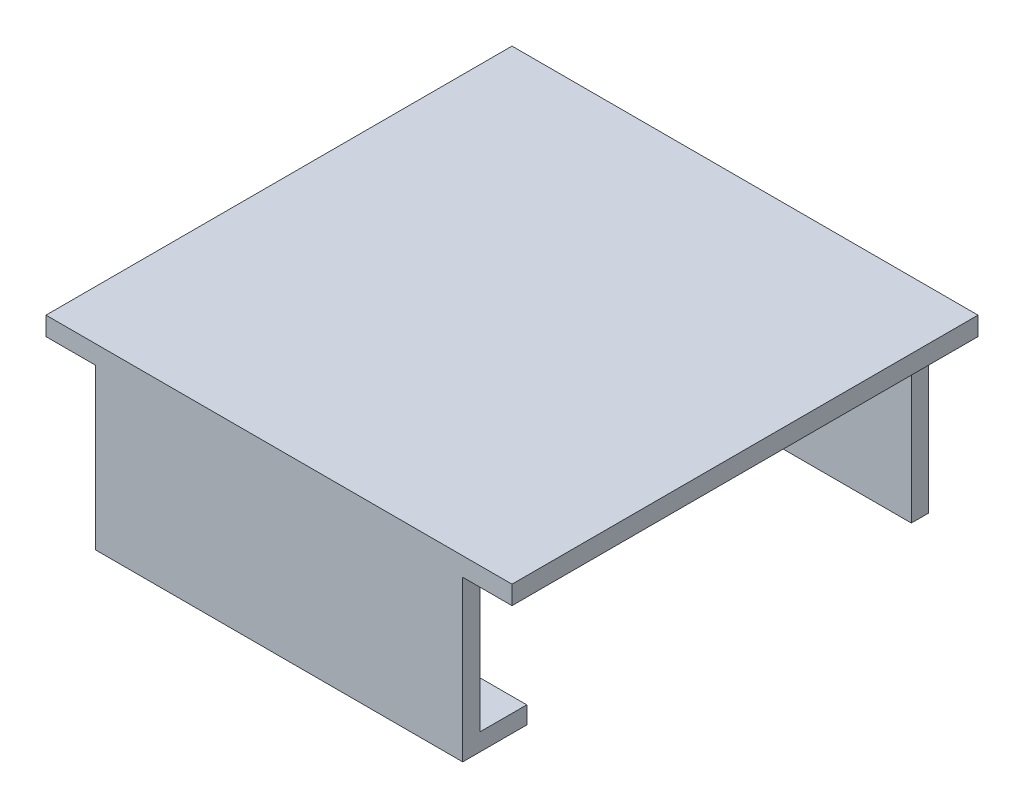
ISO-10303-21;
HEADER;
FILE_DESCRIPTION(('STEP AP214'),'2;1');
FILE_NAME('part.step','',(''),(''),'','','');
FILE_SCHEMA(('AUTOMOTIVE_DESIGN { 1 0 10303 214 1 1 1 1 }'));
ENDSEC;
DATA;
#1=APPLICATION_CONTEXT('core data for automotive mechanical design processes');
#2=APPLICATION_PROTOCOL_DEFINITION('international standard','automotive_design',2000,#1);
#3=PRODUCT_CONTEXT('',#1,'mechanical');
#4=PRODUCT('Part','Part','',(#3));
#5=PRODUCT_RELATED_PRODUCT_CATEGORY('part','',(#4));
#6=PRODUCT_DEFINITION_FORMATION('','',#4);
#7=PRODUCT_DEFINITION_CONTEXT('part definition',#1,'design');
#8=PRODUCT_DEFINITION('design','',#6,#7);
#9=PRODUCT_DEFINITION_SHAPE('','',#8);
#10=(LENGTH_UNIT() NAMED_UNIT(*) SI_UNIT(.MILLI.,.METRE.));
#11=(NAMED_UNIT(*) PLANE_ANGLE_UNIT() SI_UNIT($,.RADIAN.));
#12=(NAMED_UNIT(*) SI_UNIT($,.STERADIAN.) SOLID_ANGLE_UNIT());
#13=UNCERTAINTY_MEASURE_WITH_UNIT(LENGTH_MEASURE(1.E-05),#10,'distance_accuracy_value','');
#14=(GEOMETRIC_REPRESENTATION_CONTEXT(3) GLOBAL_UNCERTAINTY_ASSIGNED_CONTEXT((#13)) GLOBAL_UNIT_ASSIGNED_CONTEXT((#10,
#11,#12)) REPRESENTATION_CONTEXT('',''));
#15=CARTESIAN_POINT('',(0.,0.,0.));
#16=DIRECTION('',(0.,0.,1.));
#17=DIRECTION('',(1.,0.,0.));
#18=AXIS2_PLACEMENT_3D('',#15,#16,#17);
#19=CARTESIAN_POINT('',(0.,0.,0.));
#20=DIRECTION('',(0.,1.,0.));
#21=DIRECTION('',(0.,0.,1.));
#22=AXIS2_PLACEMENT_3D('',#19,#20,#21);
#23=PLANE('',#22);
#24=DIRECTION('',(0.,0.,-1.));
#25=VECTOR('',#24,1.);
#26=CARTESIAN_POINT('',(5.285,0.,-1.87));
#27=LINE('',#26,#25);
#28=CARTESIAN_POINT('',(5.285,0.,0.));
#29=VERTEX_POINT('',#28);
#30=CARTESIAN_POINT('',(5.285,0.,-1.87));
#31=VERTEX_POINT('',#30);
#32=EDGE_CURVE('E214',#29,#31,#27,.T.);
#33=ORIENTED_EDGE('',*,*,#32,.F.);
#34=DIRECTION('',(1.,0.,0.));
#35=VECTOR('',#34,1.);
#36=CARTESIAN_POINT('',(0.,0.,0.));
#37=LINE('',#36,#35);
#38=CARTESIAN_POINT('',(0.,0.,0.));
#39=VERTEX_POINT('',#38);
#40=EDGE_CURVE('E247',#39,#29,#37,.T.);
#41=ORIENTED_EDGE('',*,*,#40,.F.);
#42=DIRECTION('',(0.,0.,-1.));
#43=VECTOR('',#42,1.);
#44=CARTESIAN_POINT('',(0.,0.,0.));
#45=LINE('',#44,#43);
#46=CARTESIAN_POINT('',(0.,0.,-50.));
#47=VERTEX_POINT('',#46);
#48=EDGE_CURVE('E238',#39,#47,#45,.T.);
#49=ORIENTED_EDGE('',*,*,#48,.T.);
#50=DIRECTION('',(1.,0.,0.));
#51=VECTOR('',#50,1.);
#52=CARTESIAN_POINT('',(0.,0.,-50.));
#53=LINE('',#52,#51);
#54=CARTESIAN_POINT('',(5.285,0.,-50.));
#55=VERTEX_POINT('',#54);
#56=EDGE_CURVE('E254',#47,#55,#53,.T.);
#57=ORIENTED_EDGE('',*,*,#56,.T.);
#58=DIRECTION('',(0.,0.,-1.));
#59=VECTOR('',#58,1.);
#60=CARTESIAN_POINT('',(5.285,0.,-50.));
#61=LINE('',#60,#59);
#62=CARTESIAN_POINT('',(5.285,0.,-48.13));
#63=VERTEX_POINT('',#62);
#64=EDGE_CURVE('E62',#63,#55,#61,.T.);
#65=ORIENTED_EDGE('',*,*,#64,.F.);
#66=DIRECTION('',(-1.,0.,0.));
#67=VECTOR('',#66,1.);
#68=CARTESIAN_POINT('',(5.285,0.,-48.13));
#69=LINE('',#68,#67);
#70=CARTESIAN_POINT('',(44.715,0.,-48.13));
#71=VERTEX_POINT('',#70);
#72=EDGE_CURVE('E226',#71,#63,#69,.T.);
#73=ORIENTED_EDGE('',*,*,#72,.F.);
#74=DIRECTION('',(0.,0.,1.));
#75=VECTOR('',#74,1.);
#76=CARTESIAN_POINT('',(44.715,0.,-50.));
#77=LINE('',#76,#75);
#78=CARTESIAN_POINT('',(44.715,0.,-50.));
#79=VERTEX_POINT('',#78);
#80=EDGE_CURVE('E223',#79,#71,#77,.T.);
#81=ORIENTED_EDGE('',*,*,#80,.F.);
#82=CARTESIAN_POINT('',(50.,0.,-50.));
#83=VERTEX_POINT('',#82);
#84=EDGE_CURVE('E253',#79,#83,#53,.T.);
#85=ORIENTED_EDGE('',*,*,#84,.T.);
#86=DIRECTION('',(0.,0.,-1.));
#87=VECTOR('',#86,1.);
#88=CARTESIAN_POINT('',(50.,0.,0.));
#89=LINE('',#88,#87);
#90=CARTESIAN_POINT('',(50.,0.,0.));
#91=VERTEX_POINT('',#90);
#92=EDGE_CURVE('E250',#91,#83,#89,.T.);
#93=ORIENTED_EDGE('',*,*,#92,.F.);
#94=CARTESIAN_POINT('',(44.715,0.,0.));
#95=VERTEX_POINT('',#94);
#96=EDGE_CURVE('E149',#95,#91,#37,.T.);
#97=ORIENTED_EDGE('',*,*,#96,.F.);
#98=DIRECTION('',(0.,0.,1.));
#99=VECTOR('',#98,1.);
#100=CARTESIAN_POINT('',(44.715,0.,-1.87));
#101=LINE('',#100,#99);
#102=CARTESIAN_POINT('',(44.715,0.,-1.87));
#103=VERTEX_POINT('',#102);
#104=EDGE_CURVE('E208',#103,#95,#101,.T.);
#105=ORIENTED_EDGE('',*,*,#104,.F.);
#106=DIRECTION('',(1.,0.,0.));
#107=VECTOR('',#106,1.);
#108=CARTESIAN_POINT('',(5.285,0.,-1.87));
#109=LINE('',#108,#107);
#110=EDGE_CURVE('E210',#31,#103,#109,.T.);
#111=ORIENTED_EDGE('',*,*,#110,.F.);
#112=EDGE_LOOP('',(#33,#41,#49,#57,#65,#73,#81,#85,#93,#97,#105,#111));
#113=FACE_BOUND('',#112,.T.);
#114=ADVANCED_FACE('F39',(#113),#23,.F.);
#115=CARTESIAN_POINT('',(0.,2.,0.));
#116=DIRECTION('',(0.,0.,-1.));
#117=DIRECTION('',(-1.,0.,0.));
#118=AXIS2_PLACEMENT_3D('',#115,#116,#117);
#119=PLANE('',#118);
#120=ORIENTED_EDGE('',*,*,#40,.T.);
#121=DIRECTION('',(0.,1.,0.));
#122=VECTOR('',#121,1.);
#123=CARTESIAN_POINT('',(5.285,-17.16,0.));
#124=LINE('',#123,#122);
#125=CARTESIAN_POINT('',(5.285,-17.16,0.));
#126=VERTEX_POINT('',#125);
#127=EDGE_CURVE('E199',#126,#29,#124,.T.);
#128=ORIENTED_EDGE('',*,*,#127,.F.);
#129=DIRECTION('',(-1.,0.,0.));
#130=VECTOR('',#129,1.);
#131=CARTESIAN_POINT('',(5.285,-17.16,0.));
#132=LINE('',#131,#130);
#133=CARTESIAN_POINT('',(44.715,-17.16,0.));
#134=VERTEX_POINT('',#133);
#135=EDGE_CURVE('E211',#134,#126,#132,.T.);
#136=ORIENTED_EDGE('',*,*,#135,.F.);
#137=DIRECTION('',(0.,1.,0.));
#138=VECTOR('',#137,1.);
#139=CARTESIAN_POINT('',(44.715,-17.16,0.));
#140=LINE('',#139,#138);
#141=EDGE_CURVE('E54',#134,#95,#140,.T.);
#142=ORIENTED_EDGE('',*,*,#141,.T.);
#143=ORIENTED_EDGE('',*,*,#96,.T.);
#144=DIRECTION('',(0.,-1.,0.));
#145=VECTOR('',#144,1.);
#146=CARTESIAN_POINT('',(50.,2.,0.));
#147=LINE('',#146,#145);
#148=CARTESIAN_POINT('',(50.,2.,0.));
#149=VERTEX_POINT('',#148);
#150=EDGE_CURVE('E11',#149,#91,#147,.T.);
#151=ORIENTED_EDGE('',*,*,#150,.F.);
#152=DIRECTION('',(1.,0.,0.));
#153=VECTOR('',#152,1.);
#154=CARTESIAN_POINT('',(0.,2.,0.));
#155=LINE('',#154,#153);
#156=CARTESIAN_POINT('',(0.,2.,0.));
#157=VERTEX_POINT('',#156);
#158=EDGE_CURVE('E234',#157,#149,#155,.T.);
#159=ORIENTED_EDGE('',*,*,#158,.F.);
#160=DIRECTION('',(0.,-1.,0.));
#161=VECTOR('',#160,1.);
#162=CARTESIAN_POINT('',(0.,2.,0.));
#163=LINE('',#162,#161);
#164=EDGE_CURVE('E246',#157,#39,#163,.T.);
#165=ORIENTED_EDGE('',*,*,#164,.T.);
#166=EDGE_LOOP('',(#120,#128,#136,#142,#143,#151,#159,#165));
#167=FACE_BOUND('',#166,.T.);
#168=ADVANCED_FACE('F41',(#167),#119,.F.);
#169=CARTESIAN_POINT('',(50.,2.,0.));
#170=DIRECTION('',(-1.,0.,0.));
#171=DIRECTION('',(0.,0.,1.));
#172=AXIS2_PLACEMENT_3D('',#169,#170,#171);
#173=PLANE('',#172);
#174=ORIENTED_EDGE('',*,*,#92,.T.);
#175=DIRECTION('',(0.,-1.,0.));
#176=VECTOR('',#175,1.);
#177=CARTESIAN_POINT('',(50.,2.,-50.));
#178=LINE('',#177,#176);
#179=CARTESIAN_POINT('',(50.,2.,-50.));
#180=VERTEX_POINT('',#179);
#181=EDGE_CURVE('E47',#180,#83,#178,.T.);
#182=ORIENTED_EDGE('',*,*,#181,.F.);
#183=DIRECTION('',(0.,0.,-1.));
#184=VECTOR('',#183,1.);
#185=CARTESIAN_POINT('',(50.,2.,0.));
#186=LINE('',#185,#184);
#187=EDGE_CURVE('E237',#149,#180,#186,.T.);
#188=ORIENTED_EDGE('',*,*,#187,.F.);
#189=ORIENTED_EDGE('',*,*,#150,.T.);
#190=EDGE_LOOP('',(#174,#182,#188,#189));
#191=FACE_BOUND('',#190,.T.);
#192=ADVANCED_FACE('F265',(#191),#173,.F.);
#193=CARTESIAN_POINT('',(0.,2.,-50.));
#194=DIRECTION('',(0.,0.,-1.));
#195=DIRECTION('',(-1.,0.,0.));
#196=AXIS2_PLACEMENT_3D('',#193,#194,#195);
#197=PLANE('',#196);
#198=ORIENTED_EDGE('',*,*,#56,.F.);
#199=DIRECTION('',(0.,-1.,0.));
#200=VECTOR('',#199,1.);
#201=CARTESIAN_POINT('',(0.,2.,-50.));
#202=LINE('',#201,#200);
#203=CARTESIAN_POINT('',(0.,2.,-50.));
#204=VERTEX_POINT('',#203);
#205=EDGE_CURVE('E259',#204,#47,#202,.T.);
#206=ORIENTED_EDGE('',*,*,#205,.F.);
#207=DIRECTION('',(1.,0.,0.));
#208=VECTOR('',#207,1.);
#209=CARTESIAN_POINT('',(0.,2.,-50.));
#210=LINE('',#209,#208);
#211=EDGE_CURVE('E240',#204,#180,#210,.T.);
#212=ORIENTED_EDGE('',*,*,#211,.T.);
#213=ORIENTED_EDGE('',*,*,#181,.T.);
#214=ORIENTED_EDGE('',*,*,#84,.F.);
#215=DIRECTION('',(0.,1.,0.));
#216=VECTOR('',#215,1.);
#217=CARTESIAN_POINT('',(44.715,-17.16,-50.));
#218=LINE('',#217,#216);
#219=CARTESIAN_POINT('',(44.715,-19.03,-50.));
#220=VERTEX_POINT('',#219);
#221=EDGE_CURVE('E150',#220,#79,#218,.T.);
#222=ORIENTED_EDGE('',*,*,#221,.F.);
#223=DIRECTION('',(1.,0.,0.));
#224=VECTOR('',#223,1.);
#225=CARTESIAN_POINT('',(5.285,-19.03,-50.));
#226=LINE('',#225,#224);
#227=CARTESIAN_POINT('',(5.285,-19.03,-50.));
#228=VERTEX_POINT('',#227);
#229=EDGE_CURVE('E153',#228,#220,#226,.T.);
#230=ORIENTED_EDGE('',*,*,#229,.F.);
#231=DIRECTION('',(0.,1.,0.));
#232=VECTOR('',#231,1.);
#233=CARTESIAN_POINT('',(5.285,-17.16,-50.));
#234=LINE('',#233,#232);
#235=EDGE_CURVE('E141',#228,#55,#234,.T.);
#236=ORIENTED_EDGE('',*,*,#235,.T.);
#237=EDGE_LOOP('',(#198,#206,#212,#213,#214,#222,#230,#236));
#238=FACE_BOUND('',#237,.T.);
#239=ADVANCED_FACE('F154',(#238),#197,.T.);
#240=CARTESIAN_POINT('',(0.,2.,0.));
#241=DIRECTION('',(-1.,0.,0.));
#242=DIRECTION('',(0.,0.,1.));
#243=AXIS2_PLACEMENT_3D('',#240,#241,#242);
#244=PLANE('',#243);
#245=ORIENTED_EDGE('',*,*,#48,.F.);
#246=ORIENTED_EDGE('',*,*,#164,.F.);
#247=DIRECTION('',(0.,0.,-1.));
#248=VECTOR('',#247,1.);
#249=CARTESIAN_POINT('',(0.,2.,0.));
#250=LINE('',#249,#248);
#251=EDGE_CURVE('E243',#157,#204,#250,.T.);
#252=ORIENTED_EDGE('',*,*,#251,.T.);
#253=ORIENTED_EDGE('',*,*,#205,.T.);
#254=EDGE_LOOP('',(#245,#246,#252,#253));
#255=FACE_BOUND('',#254,.T.);
#256=ADVANCED_FACE('F297',(#255),#244,.T.);
#257=CARTESIAN_POINT('',(0.,2.,0.));
#258=DIRECTION('',(0.,1.,0.));
#259=DIRECTION('',(0.,0.,1.));
#260=AXIS2_PLACEMENT_3D('',#257,#258,#259);
#261=PLANE('',#260);
#262=ORIENTED_EDGE('',*,*,#158,.T.);
#263=ORIENTED_EDGE('',*,*,#187,.T.);
#264=ORIENTED_EDGE('',*,*,#211,.F.);
#265=ORIENTED_EDGE('',*,*,#251,.F.);
#266=EDGE_LOOP('',(#262,#263,#264,#265));
#267=FACE_BOUND('',#266,.T.);
#268=ADVANCED_FACE('F295',(#267),#261,.T.);
#269=CARTESIAN_POINT('',(5.285,-17.16,-50.));
#270=DIRECTION('',(1.,0.,0.));
#271=DIRECTION('',(0.,0.,-1.));
#272=AXIS2_PLACEMENT_3D('',#269,#270,#271);
#273=PLANE('',#272);
#274=ORIENTED_EDGE('',*,*,#64,.T.);
#275=ORIENTED_EDGE('',*,*,#235,.F.);
#276=DIRECTION('',(0.,0.,-1.));
#277=VECTOR('',#276,1.);
#278=CARTESIAN_POINT('',(5.285,-19.03,-48.13));
#279=LINE('',#278,#277);
#280=CARTESIAN_POINT('',(5.285,-19.03,-48.13));
#281=VERTEX_POINT('',#280);
#282=EDGE_CURVE('E146',#281,#228,#279,.T.);
#283=ORIENTED_EDGE('',*,*,#282,.F.);
#284=DIRECTION('',(0.,1.,0.));
#285=VECTOR('',#284,1.);
#286=CARTESIAN_POINT('',(5.285,-17.16,-48.13));
#287=LINE('',#286,#285);
#288=EDGE_CURVE('E228',#281,#63,#287,.T.);
#289=ORIENTED_EDGE('',*,*,#288,.T.);
#290=EDGE_LOOP('',(#274,#275,#283,#289));
#291=FACE_BOUND('',#290,.T.);
#292=ADVANCED_FACE('F143',(#291),#273,.F.);
#293=CARTESIAN_POINT('',(44.715,-17.16,-50.));
#294=DIRECTION('',(-1.,0.,0.));
#295=DIRECTION('',(0.,0.,1.));
#296=AXIS2_PLACEMENT_3D('',#293,#294,#295);
#297=PLANE('',#296);
#298=ORIENTED_EDGE('',*,*,#80,.T.);
#299=DIRECTION('',(0.,1.,0.));
#300=VECTOR('',#299,1.);
#301=CARTESIAN_POINT('',(44.715,-17.16,-48.13));
#302=LINE('',#301,#300);
#303=CARTESIAN_POINT('',(44.715,-19.03,-48.13));
#304=VERTEX_POINT('',#303);
#305=EDGE_CURVE('E230',#304,#71,#302,.T.);
#306=ORIENTED_EDGE('',*,*,#305,.F.);
#307=DIRECTION('',(0.,0.,1.));
#308=VECTOR('',#307,1.);
#309=CARTESIAN_POINT('',(44.715,-19.03,-48.13));
#310=LINE('',#309,#308);
#311=EDGE_CURVE('E160',#220,#304,#310,.T.);
#312=ORIENTED_EDGE('',*,*,#311,.F.);
#313=ORIENTED_EDGE('',*,*,#221,.T.);
#314=EDGE_LOOP('',(#298,#306,#312,#313));
#315=FACE_BOUND('',#314,.T.);
#316=ADVANCED_FACE('F271',(#315),#297,.F.);
#317=CARTESIAN_POINT('',(5.285,-17.16,-48.13));
#318=DIRECTION('',(0.,0.,-1.));
#319=DIRECTION('',(-1.,0.,0.));
#320=AXIS2_PLACEMENT_3D('',#317,#318,#319);
#321=PLANE('',#320);
#322=ORIENTED_EDGE('',*,*,#72,.T.);
#323=ORIENTED_EDGE('',*,*,#288,.F.);
#324=DIRECTION('',(-1.,0.,0.));
#325=VECTOR('',#324,1.);
#326=CARTESIAN_POINT('',(5.285,-19.03,-48.13));
#327=LINE('',#326,#325);
#328=EDGE_CURVE('E165',#304,#281,#327,.T.);
#329=ORIENTED_EDGE('',*,*,#328,.F.);
#330=ORIENTED_EDGE('',*,*,#305,.T.);
#331=EDGE_LOOP('',(#322,#323,#329,#330));
#332=FACE_BOUND('',#331,.T.);
#333=ADVANCED_FACE('F273',(#332),#321,.F.);
#334=CARTESIAN_POINT('',(5.285,-17.16,-1.87));
#335=DIRECTION('',(1.,0.,0.));
#336=DIRECTION('',(0.,0.,-1.));
#337=AXIS2_PLACEMENT_3D('',#334,#335,#336);
#338=PLANE('',#337);
#339=ORIENTED_EDGE('',*,*,#32,.T.);
#340=DIRECTION('',(0.,1.,0.));
#341=VECTOR('',#340,1.);
#342=CARTESIAN_POINT('',(5.285,-17.16,-1.87));
#343=LINE('',#342,#341);
#344=CARTESIAN_POINT('',(5.285,-15.29,-1.87));
#345=VERTEX_POINT('',#344);
#346=EDGE_CURVE('E202',#345,#31,#343,.T.);
#347=ORIENTED_EDGE('',*,*,#346,.F.);
#348=DIRECTION('',(0.,0.,1.));
#349=VECTOR('',#348,1.);
#350=CARTESIAN_POINT('',(5.285,-15.29,-6.87));
#351=LINE('',#350,#349);
#352=CARTESIAN_POINT('',(5.285,-15.29,-6.87));
#353=VERTEX_POINT('',#352);
#354=EDGE_CURVE('E197',#353,#345,#351,.T.);
#355=ORIENTED_EDGE('',*,*,#354,.F.);
#356=DIRECTION('',(0.,1.,0.));
#357=VECTOR('',#356,1.);
#358=CARTESIAN_POINT('',(5.285,-17.16,-6.87));
#359=LINE('',#358,#357);
#360=CARTESIAN_POINT('',(5.285,-17.16,-6.87));
#361=VERTEX_POINT('',#360);
#362=EDGE_CURVE('E189',#361,#353,#359,.T.);
#363=ORIENTED_EDGE('',*,*,#362,.F.);
#364=DIRECTION('',(0.,0.,-1.));
#365=VECTOR('',#364,1.);
#366=CARTESIAN_POINT('',(5.285,-17.16,-1.87));
#367=LINE('',#366,#365);
#368=EDGE_CURVE('E218',#126,#361,#367,.T.);
#369=ORIENTED_EDGE('',*,*,#368,.F.);
#370=ORIENTED_EDGE('',*,*,#127,.T.);
#371=EDGE_LOOP('',(#339,#347,#355,#363,#369,#370));
#372=FACE_BOUND('',#371,.T.);
#373=ADVANCED_FACE('F275',(#372),#338,.F.);
#374=CARTESIAN_POINT('',(5.285,-17.16,-1.87));
#375=DIRECTION('',(0.,0.,1.));
#376=DIRECTION('',(1.,0.,0.));
#377=AXIS2_PLACEMENT_3D('',#374,#375,#376);
#378=PLANE('',#377);
#379=DIRECTION('',(0.,1.,0.));
#380=VECTOR('',#379,1.);
#381=CARTESIAN_POINT('',(44.715,-17.16,-1.87));
#382=LINE('',#381,#380);
#383=CARTESIAN_POINT('',(44.715,-15.29,-1.87));
#384=VERTEX_POINT('',#383);
#385=EDGE_CURVE('E204',#384,#103,#382,.T.);
#386=ORIENTED_EDGE('',*,*,#385,.F.);
#387=DIRECTION('',(-1.,0.,0.));
#388=VECTOR('',#387,1.);
#389=CARTESIAN_POINT('',(44.715,-15.29,-1.87));
#390=LINE('',#389,#388);
#391=EDGE_CURVE('E182',#384,#345,#390,.T.);
#392=ORIENTED_EDGE('',*,*,#391,.T.);
#393=ORIENTED_EDGE('',*,*,#346,.T.);
#394=ORIENTED_EDGE('',*,*,#110,.T.);
#395=EDGE_LOOP('',(#386,#392,#393,#394));
#396=FACE_BOUND('',#395,.T.);
#397=ADVANCED_FACE('F282',(#396),#378,.F.);
#398=CARTESIAN_POINT('',(44.715,-17.16,-1.87));
#399=DIRECTION('',(-1.,0.,0.));
#400=DIRECTION('',(0.,0.,1.));
#401=AXIS2_PLACEMENT_3D('',#398,#399,#400);
#402=PLANE('',#401);
#403=ORIENTED_EDGE('',*,*,#104,.T.);
#404=ORIENTED_EDGE('',*,*,#141,.F.);
#405=DIRECTION('',(0.,0.,1.));
#406=VECTOR('',#405,1.);
#407=CARTESIAN_POINT('',(44.715,-17.16,-1.87));
#408=LINE('',#407,#406);
#409=CARTESIAN_POINT('',(44.715,-17.16,-6.87));
#410=VERTEX_POINT('',#409);
#411=EDGE_CURVE('E207',#410,#134,#408,.T.);
#412=ORIENTED_EDGE('',*,*,#411,.F.);
#413=DIRECTION('',(0.,1.,0.));
#414=VECTOR('',#413,1.);
#415=CARTESIAN_POINT('',(44.715,-17.16,-6.87));
#416=LINE('',#415,#414);
#417=CARTESIAN_POINT('',(44.715,-15.29,-6.87));
#418=VERTEX_POINT('',#417);
#419=EDGE_CURVE('E183',#410,#418,#416,.T.);
#420=ORIENTED_EDGE('',*,*,#419,.T.);
#421=DIRECTION('',(0.,0.,1.));
#422=VECTOR('',#421,1.);
#423=CARTESIAN_POINT('',(44.715,-15.29,-6.87));
#424=LINE('',#423,#422);
#425=EDGE_CURVE('E194',#418,#384,#424,.T.);
#426=ORIENTED_EDGE('',*,*,#425,.T.);
#427=ORIENTED_EDGE('',*,*,#385,.T.);
#428=EDGE_LOOP('',(#403,#404,#412,#420,#426,#427));
#429=FACE_BOUND('',#428,.T.);
#430=ADVANCED_FACE('F384',(#429),#402,.F.);
#431=CARTESIAN_POINT('',(0.,-17.16,0.));
#432=DIRECTION('',(0.,-1.,0.));
#433=DIRECTION('',(0.,0.,-1.));
#434=AXIS2_PLACEMENT_3D('',#431,#432,#433);
#435=PLANE('',#434);
#436=CARTESIAN_POINT('',(36.195,-17.16,-4.37));
#437=DIRECTION('',(0.,-1.,0.));
#438=DIRECTION('',(0.,0.,-1.));
#439=AXIS2_PLACEMENT_3D('',#436,#437,#438);
#440=CIRCLE('',#439,1.79999999999999);
#441=CARTESIAN_POINT('',(36.195,-17.16,-6.16999999999999));
#442=VERTEX_POINT('',#441);
#443=EDGE_CURVE('E173',#442,#442,#440,.T.);
#444=ORIENTED_EDGE('',*,*,#443,.F.);
#445=EDGE_LOOP('',(#444));
#446=FACE_BOUND('',#445,.T.);
#447=CARTESIAN_POINT('',(13.805,-17.16,-4.37));
#448=DIRECTION('',(0.,-1.,0.));
#449=DIRECTION('',(0.,0.,-1.));
#450=AXIS2_PLACEMENT_3D('',#447,#448,#449);
#451=CIRCLE('',#450,1.79999999999999);
#452=CARTESIAN_POINT('',(13.805,-17.16,-6.16999999999999));
#453=VERTEX_POINT('',#452);
#454=EDGE_CURVE('E179',#453,#453,#451,.T.);
#455=ORIENTED_EDGE('',*,*,#454,.F.);
#456=EDGE_LOOP('',(#455));
#457=FACE_BOUND('',#456,.T.);
#458=ORIENTED_EDGE('',*,*,#135,.T.);
#459=ORIENTED_EDGE('',*,*,#368,.T.);
#460=DIRECTION('',(-1.,0.,0.));
#461=VECTOR('',#460,1.);
#462=CARTESIAN_POINT('',(44.715,-17.16,-6.87));
#463=LINE('',#462,#461);
#464=EDGE_CURVE('E191',#410,#361,#463,.T.);
#465=ORIENTED_EDGE('',*,*,#464,.F.);
#466=ORIENTED_EDGE('',*,*,#411,.T.);
#467=EDGE_LOOP('',(#458,#459,#465,#466));
#468=FACE_BOUND('',#467,.T.);
#469=ADVANCED_FACE('F393',(#446,#457,#468),#435,.T.);
#470=CARTESIAN_POINT('',(44.715,-15.29,-6.87));
#471=DIRECTION('',(0.,1.,0.));
#472=DIRECTION('',(0.,0.,1.));
#473=AXIS2_PLACEMENT_3D('',#470,#471,#472);
#474=PLANE('',#473);
#475=CARTESIAN_POINT('',(36.195,-15.29,-4.37));
#476=DIRECTION('',(0.,1.,0.));
#477=DIRECTION('',(0.,0.,1.));
#478=AXIS2_PLACEMENT_3D('',#475,#476,#477);
#479=CIRCLE('',#478,1.79999999999999);
#480=CARTESIAN_POINT('',(36.195,-15.29,-2.57000000000001));
#481=VERTEX_POINT('',#480);
#482=EDGE_CURVE('E170',#481,#481,#479,.T.);
#483=ORIENTED_EDGE('',*,*,#482,.F.);
#484=EDGE_LOOP('',(#483));
#485=FACE_BOUND('',#484,.T.);
#486=CARTESIAN_POINT('',(13.805,-15.29,-4.37));
#487=DIRECTION('',(0.,1.,0.));
#488=DIRECTION('',(0.,0.,1.));
#489=AXIS2_PLACEMENT_3D('',#486,#487,#488);
#490=CIRCLE('',#489,1.79999999999999);
#491=CARTESIAN_POINT('',(13.805,-15.29,-2.57000000000001));
#492=VERTEX_POINT('',#491);
#493=EDGE_CURVE('E176',#492,#492,#490,.T.);
#494=ORIENTED_EDGE('',*,*,#493,.F.);
#495=EDGE_LOOP('',(#494));
#496=FACE_BOUND('',#495,.T.);
#497=ORIENTED_EDGE('',*,*,#391,.F.);
#498=ORIENTED_EDGE('',*,*,#425,.F.);
#499=DIRECTION('',(-1.,0.,0.));
#500=VECTOR('',#499,1.);
#501=CARTESIAN_POINT('',(44.715,-15.29,-6.87));
#502=LINE('',#501,#500);
#503=EDGE_CURVE('E186',#418,#353,#502,.T.);
#504=ORIENTED_EDGE('',*,*,#503,.T.);
#505=ORIENTED_EDGE('',*,*,#354,.T.);
#506=EDGE_LOOP('',(#497,#498,#504,#505));
#507=FACE_BOUND('',#506,.T.);
#508=ADVANCED_FACE('F404',(#485,#496,#507),#474,.T.);
#509=CARTESIAN_POINT('',(0.,0.,-6.87));
#510=DIRECTION('',(0.,0.,1.));
#511=DIRECTION('',(1.,0.,0.));
#512=AXIS2_PLACEMENT_3D('',#509,#510,#511);
#513=PLANE('',#512);
#514=ORIENTED_EDGE('',*,*,#419,.F.);
#515=ORIENTED_EDGE('',*,*,#464,.T.);
#516=ORIENTED_EDGE('',*,*,#362,.T.);
#517=ORIENTED_EDGE('',*,*,#503,.F.);
#518=EDGE_LOOP('',(#514,#515,#516,#517));
#519=FACE_BOUND('',#518,.T.);
#520=ADVANCED_FACE('F417',(#519),#513,.F.);
#521=CARTESIAN_POINT('',(13.805,-15.29,-4.37));
#522=DIRECTION('',(0.,1.,0.));
#523=DIRECTION('',(0.,0.,1.));
#524=AXIS2_PLACEMENT_3D('',#521,#522,#523);
#525=CYLINDRICAL_SURFACE('',#524,1.79999999999999);
#526=ORIENTED_EDGE('',*,*,#454,.T.);
#527=EDGE_LOOP('',(#526));
#528=FACE_BOUND('',#527,.T.);
#529=ORIENTED_EDGE('',*,*,#493,.T.);
#530=EDGE_LOOP('',(#529));
#531=FACE_BOUND('',#530,.T.);
#532=ADVANCED_FACE('F427',(#528,#531),#525,.F.);
#533=CARTESIAN_POINT('',(36.195,-15.29,-4.37));
#534=DIRECTION('',(0.,1.,0.));
#535=DIRECTION('',(0.,0.,1.));
#536=AXIS2_PLACEMENT_3D('',#533,#534,#535);
#537=CYLINDRICAL_SURFACE('',#536,1.79999999999999);
#538=ORIENTED_EDGE('',*,*,#443,.T.);
#539=EDGE_LOOP('',(#538));
#540=FACE_BOUND('',#539,.T.);
#541=ORIENTED_EDGE('',*,*,#482,.T.);
#542=EDGE_LOOP('',(#541));
#543=FACE_BOUND('',#542,.T.);
#544=ADVANCED_FACE('F435',(#540,#543),#537,.F.);
#545=CARTESIAN_POINT('',(0.,-19.03,0.));
#546=DIRECTION('',(0.,-1.,0.));
#547=DIRECTION('',(0.,0.,-1.));
#548=AXIS2_PLACEMENT_3D('',#545,#546,#547);
#549=PLANE('',#548);
#550=ORIENTED_EDGE('',*,*,#282,.T.);
#551=ORIENTED_EDGE('',*,*,#229,.T.);
#552=ORIENTED_EDGE('',*,*,#311,.T.);
#553=ORIENTED_EDGE('',*,*,#328,.T.);
#554=EDGE_LOOP('',(#550,#551,#552,#553));
#555=FACE_BOUND('',#554,.T.);
#556=ADVANCED_FACE('F163',(#555),#549,.T.);
#557=CLOSED_SHELL('',(#114,#168,#192,#239,#256,#268,#292,#316,#333,#373,#397,#430,#469,#508,
#520,#532,#544,#556));
#558=MANIFOLD_SOLID_BREP('B2',#557);
#559=ADVANCED_BREP_SHAPE_REPRESENTATION('',(#18,#558),#14);
#560=SHAPE_DEFINITION_REPRESENTATION(#9,#559);
ENDSEC;
END-ISO-10303-21;
